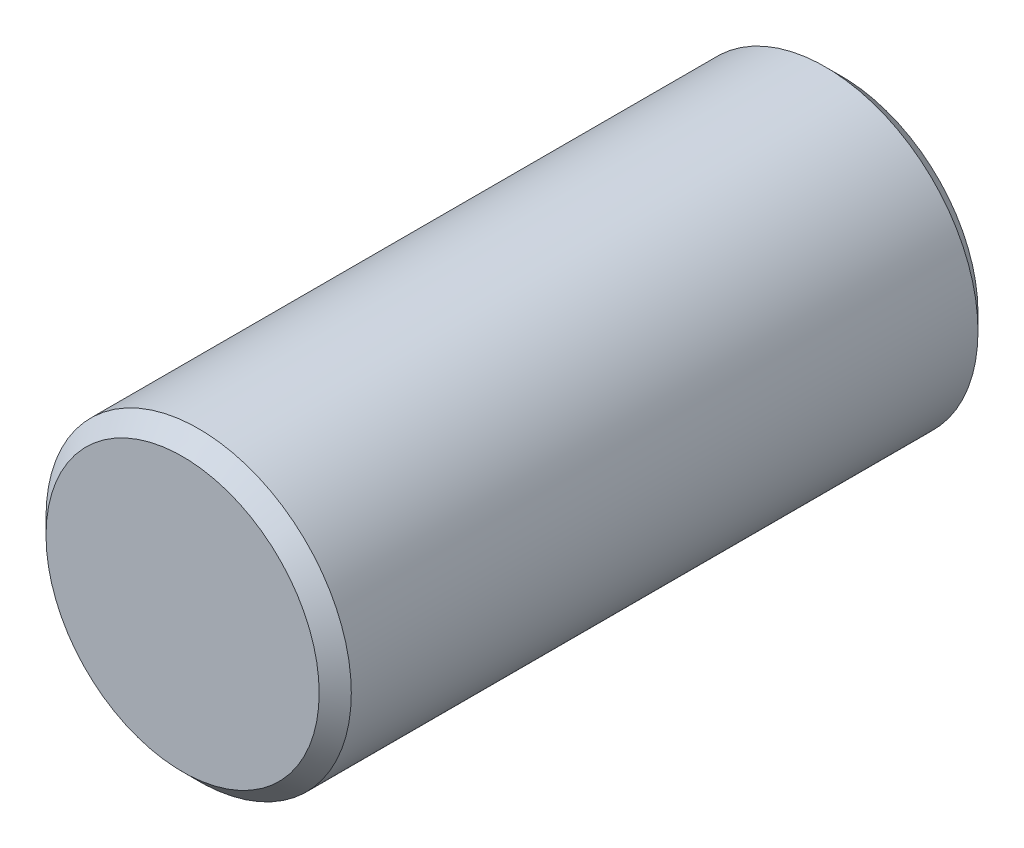
ISO-10303-21;
HEADER;
FILE_DESCRIPTION(('STEP AP214'),'2;1');
FILE_NAME('part.step','',(''),(''),'','','');
FILE_SCHEMA(('AUTOMOTIVE_DESIGN { 1 0 10303 214 1 1 1 1 }'));
ENDSEC;
DATA;
#1=APPLICATION_CONTEXT('core data for automotive mechanical design processes');
#2=APPLICATION_PROTOCOL_DEFINITION('international standard','automotive_design',2000,#1);
#3=PRODUCT_CONTEXT('',#1,'mechanical');
#4=PRODUCT('Part','Part','',(#3));
#5=PRODUCT_RELATED_PRODUCT_CATEGORY('part','',(#4));
#6=PRODUCT_DEFINITION_FORMATION('','',#4);
#7=PRODUCT_DEFINITION_CONTEXT('part definition',#1,'design');
#8=PRODUCT_DEFINITION('design','',#6,#7);
#9=PRODUCT_DEFINITION_SHAPE('','',#8);
#10=(LENGTH_UNIT() NAMED_UNIT(*) SI_UNIT(.MILLI.,.METRE.));
#11=(NAMED_UNIT(*) PLANE_ANGLE_UNIT() SI_UNIT($,.RADIAN.));
#12=(NAMED_UNIT(*) SI_UNIT($,.STERADIAN.) SOLID_ANGLE_UNIT());
#13=UNCERTAINTY_MEASURE_WITH_UNIT(LENGTH_MEASURE(1.E-05),#10,'distance_accuracy_value','');
#14=(GEOMETRIC_REPRESENTATION_CONTEXT(3) GLOBAL_UNCERTAINTY_ASSIGNED_CONTEXT((#13)) GLOBAL_UNIT_ASSIGNED_CONTEXT((#10,
#11,#12)) REPRESENTATION_CONTEXT('',''));
#15=CARTESIAN_POINT('',(0.,0.,0.));
#16=DIRECTION('',(0.,0.,1.));
#17=DIRECTION('',(1.,0.,0.));
#18=AXIS2_PLACEMENT_3D('',#15,#16,#17);
#19=CARTESIAN_POINT('',(0.,0.,41.));
#20=DIRECTION('',(0.,0.,-1.));
#21=DIRECTION('',(-1.,0.,0.));
#22=AXIS2_PLACEMENT_3D('',#19,#20,#21);
#23=CYLINDRICAL_SURFACE('',#22,19.);
#24=CARTESIAN_POINT('',(0.,0.,-39.));
#25=DIRECTION('',(0.,0.,1.));
#26=DIRECTION('',(1.,0.,0.));
#27=AXIS2_PLACEMENT_3D('',#24,#25,#26);
#28=CIRCLE('',#27,19.);
#29=CARTESIAN_POINT('',(19.,0.,-39.));
#30=VERTEX_POINT('',#29);
#31=EDGE_CURVE('E53',#30,#30,#28,.T.);
#32=ORIENTED_EDGE('',*,*,#31,.T.);
#33=EDGE_LOOP('',(#32));
#34=FACE_BOUND('',#33,.T.);
#35=CARTESIAN_POINT('',(0.,0.,39.));
#36=DIRECTION('',(0.,0.,1.));
#37=DIRECTION('',(1.,0.,0.));
#38=AXIS2_PLACEMENT_3D('',#35,#36,#37);
#39=CIRCLE('',#38,19.);
#40=CARTESIAN_POINT('',(19.,0.,39.));
#41=VERTEX_POINT('',#40);
#42=EDGE_CURVE('E58',#41,#41,#39,.F.);
#43=ORIENTED_EDGE('',*,*,#42,.T.);
#44=EDGE_LOOP('',(#43));
#45=FACE_BOUND('',#44,.T.);
#46=ADVANCED_FACE('F39',(#34,#45),#23,.T.);
#47=CARTESIAN_POINT('',(0.,0.,41.));
#48=DIRECTION('',(0.,0.,1.));
#49=DIRECTION('',(1.,0.,0.));
#50=AXIS2_PLACEMENT_3D('',#47,#48,#49);
#51=PLANE('',#50);
#52=CARTESIAN_POINT('',(0.,0.,41.));
#53=DIRECTION('',(0.,0.,1.));
#54=DIRECTION('',(1.,0.,0.));
#55=AXIS2_PLACEMENT_3D('',#52,#53,#54);
#56=CIRCLE('',#55,17.);
#57=CARTESIAN_POINT('',(17.,0.,41.));
#58=VERTEX_POINT('',#57);
#59=EDGE_CURVE('E10',#58,#58,#56,.T.);
#60=ORIENTED_EDGE('',*,*,#59,.T.);
#61=EDGE_LOOP('',(#60));
#62=FACE_BOUND('',#61,.T.);
#63=ADVANCED_FACE('F75',(#62),#51,.T.);
#64=CARTESIAN_POINT('',(0.,0.,-41.));
#65=DIRECTION('',(0.,0.,1.));
#66=DIRECTION('',(1.,0.,0.));
#67=AXIS2_PLACEMENT_3D('',#64,#65,#66);
#68=PLANE('',#67);
#69=CARTESIAN_POINT('',(0.,0.,-41.));
#70=DIRECTION('',(0.,0.,1.));
#71=DIRECTION('',(1.,0.,0.));
#72=AXIS2_PLACEMENT_3D('',#69,#70,#71);
#73=CIRCLE('',#72,17.);
#74=CARTESIAN_POINT('',(17.,0.,-41.));
#75=VERTEX_POINT('',#74);
#76=EDGE_CURVE('E48',#75,#75,#73,.F.);
#77=ORIENTED_EDGE('',*,*,#76,.T.);
#78=EDGE_LOOP('',(#77));
#79=FACE_BOUND('',#78,.T.);
#80=ADVANCED_FACE('F72',(#79),#68,.F.);
#81=CARTESIAN_POINT('',(0.,0.,-39.));
#82=DIRECTION('',(0.,0.,1.));
#83=DIRECTION('',(1.,0.,0.));
#84=AXIS2_PLACEMENT_3D('',#81,#82,#83);
#85=CONICAL_SURFACE('',#84,19.,0.785398163397447);
#86=ORIENTED_EDGE('',*,*,#76,.F.);
#87=EDGE_LOOP('',(#86));
#88=FACE_BOUND('',#87,.T.);
#89=ORIENTED_EDGE('',*,*,#31,.F.);
#90=EDGE_LOOP('',(#89));
#91=FACE_BOUND('',#90,.T.);
#92=ADVANCED_FACE('F68',(#88,#91),#85,.T.);
#93=CARTESIAN_POINT('',(0.,0.,41.));
#94=DIRECTION('',(0.,0.,-1.));
#95=DIRECTION('',(-1.,0.,0.));
#96=AXIS2_PLACEMENT_3D('',#93,#94,#95);
#97=CONICAL_SURFACE('',#96,17.,0.785398163397445);
#98=ORIENTED_EDGE('',*,*,#42,.F.);
#99=EDGE_LOOP('',(#98));
#100=FACE_BOUND('',#99,.T.);
#101=ORIENTED_EDGE('',*,*,#59,.F.);
#102=EDGE_LOOP('',(#101));
#103=FACE_BOUND('',#102,.T.);
#104=ADVANCED_FACE('F42',(#100,#103),#97,.T.);
#105=CLOSED_SHELL('',(#46,#63,#80,#92,#104));
#106=MANIFOLD_SOLID_BREP('B2',#105);
#107=ADVANCED_BREP_SHAPE_REPRESENTATION('',(#18,#106),#14);
#108=SHAPE_DEFINITION_REPRESENTATION(#9,#107);
ENDSEC;
END-ISO-10303-21;
